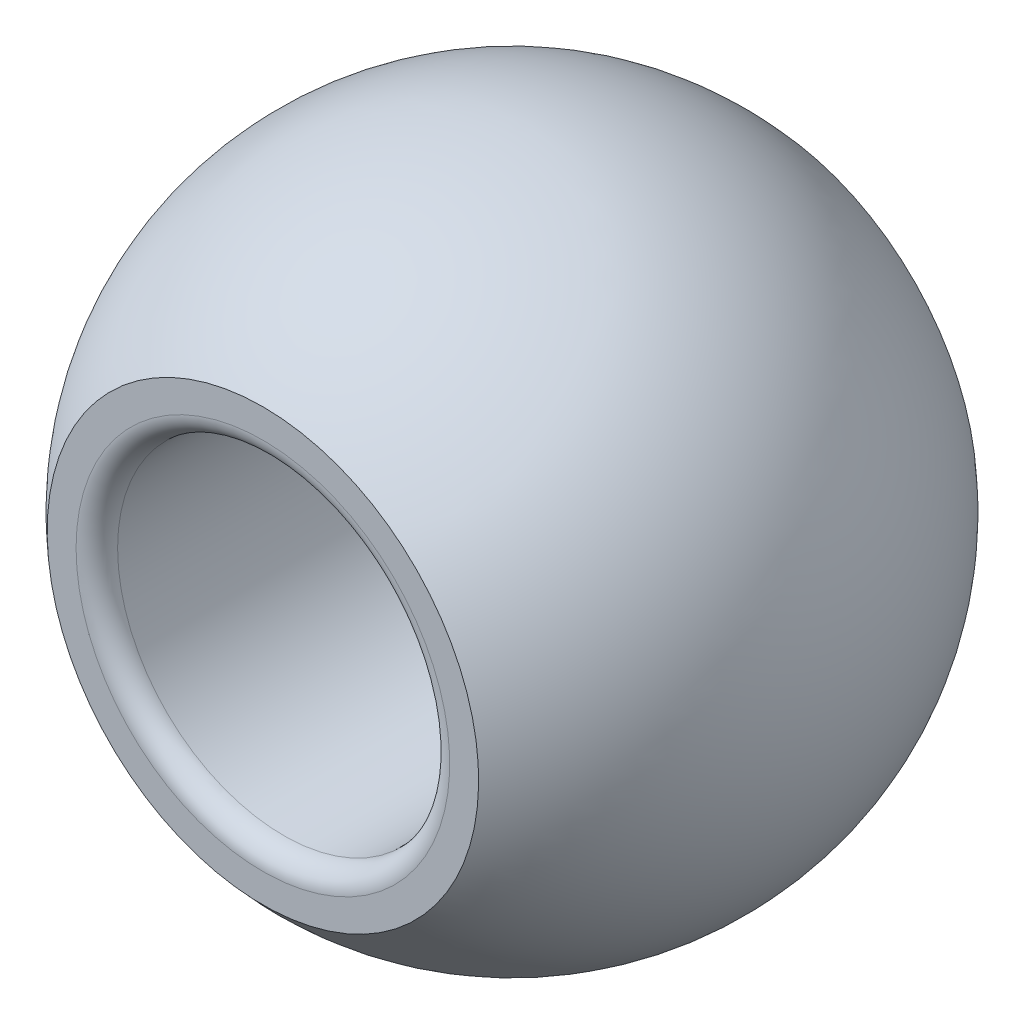
ISO-10303-21;
HEADER;
FILE_DESCRIPTION(('STEP AP214'),'2;1');
FILE_NAME('part.step','',(''),(''),'','','');
FILE_SCHEMA(('AUTOMOTIVE_DESIGN { 1 0 10303 214 1 1 1 1 }'));
ENDSEC;
DATA;
#1=APPLICATION_CONTEXT('core data for automotive mechanical design processes');
#2=APPLICATION_PROTOCOL_DEFINITION('international standard','automotive_design',2000,#1);
#3=PRODUCT_CONTEXT('',#1,'mechanical');
#4=PRODUCT('Part','Part','',(#3));
#5=PRODUCT_RELATED_PRODUCT_CATEGORY('part','',(#4));
#6=PRODUCT_DEFINITION_FORMATION('','',#4);
#7=PRODUCT_DEFINITION_CONTEXT('part definition',#1,'design');
#8=PRODUCT_DEFINITION('design','',#6,#7);
#9=PRODUCT_DEFINITION_SHAPE('','',#8);
#10=(LENGTH_UNIT() NAMED_UNIT(*) SI_UNIT(.MILLI.,.METRE.));
#11=(NAMED_UNIT(*) PLANE_ANGLE_UNIT() SI_UNIT($,.RADIAN.));
#12=(NAMED_UNIT(*) SI_UNIT($,.STERADIAN.) SOLID_ANGLE_UNIT());
#13=UNCERTAINTY_MEASURE_WITH_UNIT(LENGTH_MEASURE(1.E-05),#10,'distance_accuracy_value','');
#14=(GEOMETRIC_REPRESENTATION_CONTEXT(3) GLOBAL_UNCERTAINTY_ASSIGNED_CONTEXT((#13)) GLOBAL_UNIT_ASSIGNED_CONTEXT((#10,
#11,#12)) REPRESENTATION_CONTEXT('',''));
#15=CARTESIAN_POINT('',(0.,0.,0.));
#16=DIRECTION('',(0.,0.,1.));
#17=DIRECTION('',(1.,0.,0.));
#18=AXIS2_PLACEMENT_3D('',#15,#16,#17);
#19=CARTESIAN_POINT('',(0.,0.,0.));
#20=DIRECTION('',(0.,0.,-1.));
#21=DIRECTION('',(0.,1.,0.));
#22=AXIS2_PLACEMENT_3D('',#19,#20,#21);
#23=SPHERICAL_SURFACE('',#22,7.93750000000009);
#24=CARTESIAN_POINT('',(0.,0.,6.));
#25=DIRECTION('',(0.,0.,-1.));
#26=DIRECTION('',(-1.,0.,0.));
#27=AXIS2_PLACEMENT_3D('',#24,#25,#26);
#28=CIRCLE('',#27,5.19652828819409);
#29=CARTESIAN_POINT('',(0.,5.19652828819401,6.));
#30=VERTEX_POINT('',#29);
#31=EDGE_CURVE('E37',#30,#30,#28,.T.);
#32=CARTESIAN_POINT('',(0.,0.,-6.));
#33=DIRECTION('',(0.,0.,-1.));
#34=DIRECTION('',(-1.,0.,0.));
#35=AXIS2_PLACEMENT_3D('',#32,#33,#34);
#36=CIRCLE('',#35,5.19652828819409);
#37=CARTESIAN_POINT('',(0.,5.19652828819401,-6.));
#38=VERTEX_POINT('',#37);
#39=EDGE_CURVE('E34',#38,#38,#36,.T.);
#40=CARTESIAN_POINT('',(0.,5.19652828819401,6.));
#41=CARTESIAN_POINT('',(0.,5.30366051736902,5.90721922322285));
#42=CARTESIAN_POINT('',(0.,5.40830248423489,5.81156370117377));
#43=CARTESIAN_POINT('',(0.,5.61231764773256,5.61478991259452));
#44=CARTESIAN_POINT('',(0.,5.71169084436437,5.51367164606435));
#45=CARTESIAN_POINT('',(0.,5.90488022177817,5.30625911458572));
#46=CARTESIAN_POINT('',(0.,5.99869640256015,5.19996484963726));
#47=CARTESIAN_POINT('',(0.,6.18050349258253,4.98250611345212));
#48=CARTESIAN_POINT('',(0.,6.26849440182292,4.87134164221544));
#49=CARTESIAN_POINT('',(0.,6.43839831775005,4.6444611307126));
#50=CARTESIAN_POINT('',(0.,6.52031132443679,4.52874509044644));
#51=CARTESIAN_POINT('',(0.,6.67782452944383,4.29309343576294));
#52=CARTESIAN_POINT('',(0.,6.75342472776412,4.17315782134561));
#53=CARTESIAN_POINT('',(0.,6.89809544059408,3.92941103630135));
#54=CARTESIAN_POINT('',(0.,6.96716595510373,3.80559986567444));
#55=CARTESIAN_POINT('',(0.,7.09857917612494,3.55445712481945));
#56=CARTESIAN_POINT('',(0.,7.16092188263649,3.42712555459138));
#57=CARTESIAN_POINT('',(0.,7.27870065658108,3.16930726360065));
#58=CARTESIAN_POINT('',(0.,7.33413672401412,3.03882054283798));
#59=CARTESIAN_POINT('',(0.,7.43794320189702,2.77506625194002));
#60=CARTESIAN_POINT('',(0.,7.48631361234688,2.64179868180472));
#61=CARTESIAN_POINT('',(0.,7.57585002577665,2.37286496976654));
#62=CARTESIAN_POINT('',(0.,7.61701602875655,2.23719882786366));
#63=CARTESIAN_POINT('',(0.,7.69202554269211,1.96385713030413));
#64=CARTESIAN_POINT('',(0.,7.72586905364776,1.82618157464746));
#65=CARTESIAN_POINT('',(0.,7.78613650350183,1.54921597156258));
#66=CARTESIAN_POINT('',(0.,7.81256044240023,1.40992592413436));
#67=CARTESIAN_POINT('',(0.,7.85791295113851,1.13013089066224));
#68=CARTESIAN_POINT('',(0.,7.87684152097838,0.98962590461834));
#69=CARTESIAN_POINT('',(0.,7.9071489950437,0.707804032116978));
#70=CARTESIAN_POINT('',(0.,7.91852789926915,0.566487145659515));
#71=CARTESIAN_POINT('',(0.,7.9337034017473,0.283446839468036));
#72=CARTESIAN_POINT('',(0.,7.93750000000001,0.141723419734019));
#73=CARTESIAN_POINT('',(0.,7.93750000000001,-0.141723419734016));
#74=CARTESIAN_POINT('',(0.,7.9337034017473,-0.283446839468033));
#75=CARTESIAN_POINT('',(0.,7.91852789926915,-0.566487145659513));
#76=CARTESIAN_POINT('',(0.,7.9071489950437,-0.707804032116975));
#77=CARTESIAN_POINT('',(0.,7.87684152097838,-0.989625904618338));
#78=CARTESIAN_POINT('',(0.,7.85791295113851,-1.13013089066224));
#79=CARTESIAN_POINT('',(0.,7.81256044240023,-1.40992592413436));
#80=CARTESIAN_POINT('',(0.,7.78613650350183,-1.54921597156258));
#81=CARTESIAN_POINT('',(0.,7.72586905364776,-1.82618157464746));
#82=CARTESIAN_POINT('',(0.,7.69202554269211,-1.96385713030412));
#83=CARTESIAN_POINT('',(0.,7.61701602875656,-2.23719882786366));
#84=CARTESIAN_POINT('',(0.,7.57585002577665,-2.37286496976654));
#85=CARTESIAN_POINT('',(0.,7.48631361234688,-2.64179868180472));
#86=CARTESIAN_POINT('',(0.,7.43794320189702,-2.77506625194002));
#87=CARTESIAN_POINT('',(0.,7.33413672401412,-3.03882054283798));
#88=CARTESIAN_POINT('',(0.,7.27870065658108,-3.16930726360064));
#89=CARTESIAN_POINT('',(0.,7.16092188263649,-3.42712555459137));
#90=CARTESIAN_POINT('',(0.,7.09857917612494,-3.55445712481944));
#91=CARTESIAN_POINT('',(0.,6.96716595510373,-3.80559986567443));
#92=CARTESIAN_POINT('',(0.,6.89809544059408,-3.92941103630135));
#93=CARTESIAN_POINT('',(0.,6.75342472776413,-4.17315782134561));
#94=CARTESIAN_POINT('',(0.,6.67782452944383,-4.29309343576294));
#95=CARTESIAN_POINT('',(0.,6.52031132443679,-4.52874509044644));
#96=CARTESIAN_POINT('',(0.,6.43839831775005,-4.6444611307126));
#97=CARTESIAN_POINT('',(0.,6.26849440182292,-4.87134164221544));
#98=CARTESIAN_POINT('',(0.,6.18050349258253,-4.98250611345211));
#99=CARTESIAN_POINT('',(0.,5.99869640256015,-5.19996484963726));
#100=CARTESIAN_POINT('',(0.,5.90488022177817,-5.30625911458572));
#101=CARTESIAN_POINT('',(0.,5.71169084436438,-5.51367164606435));
#102=CARTESIAN_POINT('',(0.,5.61231764773257,-5.61478991259452));
#103=CARTESIAN_POINT('',(0.,5.40830248423489,-5.81156370117377));
#104=CARTESIAN_POINT('',(0.,5.30366051736902,-5.90721922322285));
#105=CARTESIAN_POINT('',(0.,5.19652828819401,-6.));
#106=B_SPLINE_CURVE_WITH_KNOTS('',3,(#40,#41,#42,#43,#44,#45,#46,#47,#48,#49,#50,#51,#52,#53,
#54,#55,#56,#57,#58,#59,#60,#61,#62,#63,#64,#65,#66,#67,#68,#69,#70,#71,#72,#73,#74,#75,#76,#77,
#78,#79,#80,#81,#82,#83,#84,#85,#86,#87,#88,#89,#90,#91,#92,#93,#94,#95,#96,#97,#98,#99,#100,
#101,#102,#103,#104,#105),.UNSPECIFIED.,.F.,.F.,(4,2,2,2,2,2,2,2,2,2,2,2,2,2,2,2,2,2,2,2,2,2,2,
2,2,2,2,2,2,2,2,2,4),(0.,0.425119451662765,0.85023890332553,1.27535835498829,1.70047780665106,
2.12559725831382,2.55071670997659,2.97583616163935,3.40095561330212,3.82607506496488,
4.25119451662765,4.67631396829041,5.10143341995318,5.52655287161595,5.95167232327871,
6.37679177494148,6.80191122660424,7.22703067826701,7.65215012992977,8.07726958159254,
8.5023890332553,8.92750848491806,9.35262793658083,9.7777473882436,10.2028668399064,
10.6279862915691,11.0531057432319,11.4782251948947,11.9033446465574,12.3284640982202,
12.7535835498829,13.1787030015457,13.6038224532085),.UNSPECIFIED.);
#107=EDGE_CURVE('BSEAM14',#30,#38,#106,.T.);
#108=ORIENTED_EDGE('',*,*,#31,.T.);
#109=ORIENTED_EDGE('',*,*,#39,.F.);
#110=ORIENTED_EDGE('',*,*,#107,.T.);
#111=ORIENTED_EDGE('',*,*,#107,.F.);
#112=EDGE_LOOP('',(#108,#110,#109,#111));
#113=FACE_BOUND('',#112,.T.);
#114=ADVANCED_FACE('F14',(#113),#23,.T.);
#115=CARTESIAN_POINT('',(0.,5.196528288194,6.));
#116=DIRECTION('',(0.,0.,1.));
#117=DIRECTION('',(1.,0.,0.));
#118=AXIS2_PLACEMENT_3D('',#115,#116,#117);
#119=PLANE('',#118);
#120=CARTESIAN_POINT('',(0.,0.,6.));
#121=DIRECTION('',(0.,0.,-1.));
#122=DIRECTION('',(-1.,0.,0.));
#123=AXIS2_PLACEMENT_3D('',#120,#121,#122);
#124=CIRCLE('',#123,4.50000002686336);
#125=CARTESIAN_POINT('',(-4.50000002686336,0.,6.));
#126=VERTEX_POINT('',#125);
#127=EDGE_CURVE('E29',#126,#126,#124,.T.);
#128=ORIENTED_EDGE('',*,*,#127,.T.);
#129=EDGE_LOOP('',(#128));
#130=FACE_BOUND('',#129,.T.);
#131=ORIENTED_EDGE('',*,*,#31,.F.);
#132=EDGE_LOOP('',(#131));
#133=FACE_BOUND('',#132,.T.);
#134=ADVANCED_FACE('F43',(#130,#133),#119,.T.);
#135=CARTESIAN_POINT('',(0.,4.5,-6.));
#136=DIRECTION('',(0.,0.,-1.));
#137=DIRECTION('',(-1.,0.,0.));
#138=AXIS2_PLACEMENT_3D('',#135,#136,#137);
#139=PLANE('',#138);
#140=ORIENTED_EDGE('',*,*,#39,.T.);
#141=EDGE_LOOP('',(#140));
#142=FACE_BOUND('',#141,.T.);
#143=CARTESIAN_POINT('',(0.,0.,-6.));
#144=DIRECTION('',(0.,0.,-1.));
#145=DIRECTION('',(-1.,0.,0.));
#146=AXIS2_PLACEMENT_3D('',#143,#144,#145);
#147=CIRCLE('',#146,4.50000002686336);
#148=CARTESIAN_POINT('',(-4.50000002686336,0.,-6.));
#149=VERTEX_POINT('',#148);
#150=EDGE_CURVE('E25',#149,#149,#147,.T.);
#151=ORIENTED_EDGE('',*,*,#150,.F.);
#152=EDGE_LOOP('',(#151));
#153=FACE_BOUND('',#152,.T.);
#154=ADVANCED_FACE('F45',(#142,#153),#139,.T.);
#155=CARTESIAN_POINT('',(0.,0.,5.50000000000009));
#156=DIRECTION('',(0.,0.,-1.));
#157=DIRECTION('',(-1.,0.,0.));
#158=AXIS2_PLACEMENT_3D('',#155,#156,#157);
#159=TOROIDAL_SURFACE('',#158,4.49999999999991,0.499999999999911);
#160=CARTESIAN_POINT('',(0.,0.,5.5));
#161=DIRECTION('',(0.,0.,-1.));
#162=DIRECTION('',(-1.,0.,0.));
#163=AXIS2_PLACEMENT_3D('',#160,#161,#162);
#164=CIRCLE('',#163,4.);
#165=CARTESIAN_POINT('',(-4.,0.,5.5));
#166=VERTEX_POINT('',#165);
#167=EDGE_CURVE('E21',#166,#166,#164,.T.);
#168=ORIENTED_EDGE('',*,*,#167,.T.);
#169=EDGE_LOOP('',(#168));
#170=FACE_BOUND('',#169,.T.);
#171=ORIENTED_EDGE('',*,*,#127,.F.);
#172=EDGE_LOOP('',(#171));
#173=FACE_BOUND('',#172,.T.);
#174=ADVANCED_FACE('F53',(#170,#173),#159,.T.);
#175=CARTESIAN_POINT('',(0.,0.,-5.50000000000009));
#176=DIRECTION('',(0.,0.,-1.));
#177=DIRECTION('',(-1.,0.,0.));
#178=AXIS2_PLACEMENT_3D('',#175,#176,#177);
#179=TOROIDAL_SURFACE('',#178,4.49999999999991,0.499999999999911);
#180=ORIENTED_EDGE('',*,*,#150,.T.);
#181=EDGE_LOOP('',(#180));
#182=FACE_BOUND('',#181,.T.);
#183=CARTESIAN_POINT('',(0.,0.,-5.5));
#184=DIRECTION('',(0.,0.,-1.));
#185=DIRECTION('',(-1.,0.,0.));
#186=AXIS2_PLACEMENT_3D('',#183,#184,#185);
#187=CIRCLE('',#186,4.);
#188=CARTESIAN_POINT('',(-4.,0.,-5.5));
#189=VERTEX_POINT('',#188);
#190=EDGE_CURVE('E9',#189,#189,#187,.T.);
#191=ORIENTED_EDGE('',*,*,#190,.F.);
#192=EDGE_LOOP('',(#191));
#193=FACE_BOUND('',#192,.T.);
#194=ADVANCED_FACE('F59',(#182,#193),#179,.T.);
#195=CARTESIAN_POINT('',(0.,0.,-5.5));
#196=DIRECTION('',(0.,0.,-1.));
#197=DIRECTION('',(-1.,0.,0.));
#198=AXIS2_PLACEMENT_3D('',#195,#196,#197);
#199=CYLINDRICAL_SURFACE('',#198,4.);
#200=ORIENTED_EDGE('',*,*,#190,.T.);
#201=EDGE_LOOP('',(#200));
#202=FACE_BOUND('',#201,.T.);
#203=ORIENTED_EDGE('',*,*,#167,.F.);
#204=EDGE_LOOP('',(#203));
#205=FACE_BOUND('',#204,.T.);
#206=ADVANCED_FACE('F16',(#202,#205),#199,.F.);
#207=CLOSED_SHELL('',(#114,#134,#154,#174,#194,#206));
#208=MANIFOLD_SOLID_BREP('B1',#207);
#209=ADVANCED_BREP_SHAPE_REPRESENTATION('',(#18,#208),#14);
#210=SHAPE_DEFINITION_REPRESENTATION(#9,#209);
ENDSEC;
END-ISO-10303-21;
